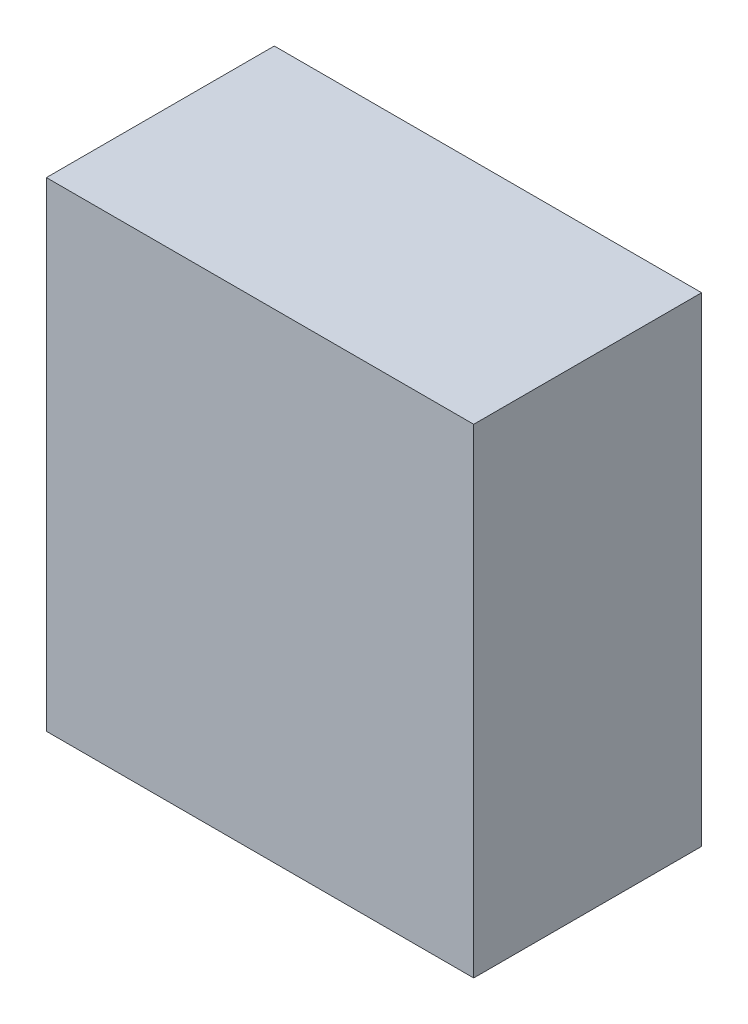
ISO-10303-21;
HEADER;
FILE_DESCRIPTION(('STEP AP214'),'2;1');
FILE_NAME('part.step','',(''),(''),'','','');
FILE_SCHEMA(('AUTOMOTIVE_DESIGN { 1 0 10303 214 1 1 1 1 }'));
ENDSEC;
DATA;
#1=APPLICATION_CONTEXT('core data for automotive mechanical design processes');
#2=APPLICATION_PROTOCOL_DEFINITION('international standard','automotive_design',2000,#1);
#3=PRODUCT_CONTEXT('',#1,'mechanical');
#4=PRODUCT('Part','Part','',(#3));
#5=PRODUCT_RELATED_PRODUCT_CATEGORY('part','',(#4));
#6=PRODUCT_DEFINITION_FORMATION('','',#4);
#7=PRODUCT_DEFINITION_CONTEXT('part definition',#1,'design');
#8=PRODUCT_DEFINITION('design','',#6,#7);
#9=PRODUCT_DEFINITION_SHAPE('','',#8);
#10=(LENGTH_UNIT() NAMED_UNIT(*) SI_UNIT(.MILLI.,.METRE.));
#11=(NAMED_UNIT(*) PLANE_ANGLE_UNIT() SI_UNIT($,.RADIAN.));
#12=(NAMED_UNIT(*) SI_UNIT($,.STERADIAN.) SOLID_ANGLE_UNIT());
#13=UNCERTAINTY_MEASURE_WITH_UNIT(LENGTH_MEASURE(1.E-05),#10,'distance_accuracy_value','');
#14=(GEOMETRIC_REPRESENTATION_CONTEXT(3) GLOBAL_UNCERTAINTY_ASSIGNED_CONTEXT((#13)) GLOBAL_UNIT_ASSIGNED_CONTEXT((#10,
#11,#12)) REPRESENTATION_CONTEXT('',''));
#15=CARTESIAN_POINT('',(0.,0.,0.));
#16=DIRECTION('',(0.,0.,1.));
#17=DIRECTION('',(1.,0.,0.));
#18=AXIS2_PLACEMENT_3D('',#15,#16,#17);
#19=CARTESIAN_POINT('',(-4.5,-5.05,4.8));
#20=DIRECTION('',(1.,0.,0.));
#21=DIRECTION('',(0.,0.,-1.));
#22=AXIS2_PLACEMENT_3D('',#19,#20,#21);
#23=PLANE('',#22);
#24=DIRECTION('',(0.,-1.,0.));
#25=VECTOR('',#24,1.);
#26=CARTESIAN_POINT('',(-4.5,-5.05,0.));
#27=LINE('',#26,#25);
#28=CARTESIAN_POINT('',(-4.5,5.05,0.));
#29=VERTEX_POINT('',#28);
#30=CARTESIAN_POINT('',(-4.5,-5.05,0.));
#31=VERTEX_POINT('',#30);
#32=EDGE_CURVE('E96',#29,#31,#27,.T.);
#33=ORIENTED_EDGE('',*,*,#32,.T.);
#34=DIRECTION('',(0.,0.,-1.));
#35=VECTOR('',#34,1.);
#36=CARTESIAN_POINT('',(-4.5,-5.05,4.8));
#37=LINE('',#36,#35);
#38=CARTESIAN_POINT('',(-4.5,-5.05,4.8));
#39=VERTEX_POINT('',#38);
#40=EDGE_CURVE('E11',#39,#31,#37,.T.);
#41=ORIENTED_EDGE('',*,*,#40,.F.);
#42=DIRECTION('',(0.,-1.,0.));
#43=VECTOR('',#42,1.);
#44=CARTESIAN_POINT('',(-4.5,-5.05,4.8));
#45=LINE('',#44,#43);
#46=CARTESIAN_POINT('',(-4.5,5.05,4.8));
#47=VERTEX_POINT('',#46);
#48=EDGE_CURVE('E84',#47,#39,#45,.T.);
#49=ORIENTED_EDGE('',*,*,#48,.F.);
#50=DIRECTION('',(0.,0.,-1.));
#51=VECTOR('',#50,1.);
#52=CARTESIAN_POINT('',(-4.5,5.05,4.8));
#53=LINE('',#52,#51);
#54=EDGE_CURVE('E92',#47,#29,#53,.T.);
#55=ORIENTED_EDGE('',*,*,#54,.T.);
#56=EDGE_LOOP('',(#33,#41,#49,#55));
#57=FACE_BOUND('',#56,.T.);
#58=ADVANCED_FACE('F33',(#57),#23,.F.);
#59=CARTESIAN_POINT('',(4.5,-5.05,4.8));
#60=DIRECTION('',(0.,1.,0.));
#61=DIRECTION('',(-1.,0.,0.));
#62=AXIS2_PLACEMENT_3D('',#59,#60,#61);
#63=PLANE('',#62);
#64=DIRECTION('',(1.,0.,0.));
#65=VECTOR('',#64,1.);
#66=CARTESIAN_POINT('',(4.5,-5.05,0.));
#67=LINE('',#66,#65);
#68=CARTESIAN_POINT('',(4.5,-5.05,0.));
#69=VERTEX_POINT('',#68);
#70=EDGE_CURVE('E88',#31,#69,#67,.T.);
#71=ORIENTED_EDGE('',*,*,#70,.T.);
#72=DIRECTION('',(0.,0.,-1.));
#73=VECTOR('',#72,1.);
#74=CARTESIAN_POINT('',(4.5,-5.05,4.8));
#75=LINE('',#74,#73);
#76=CARTESIAN_POINT('',(4.5,-5.05,4.8));
#77=VERTEX_POINT('',#76);
#78=EDGE_CURVE('E41',#77,#69,#75,.T.);
#79=ORIENTED_EDGE('',*,*,#78,.F.);
#80=DIRECTION('',(1.,0.,0.));
#81=VECTOR('',#80,1.);
#82=CARTESIAN_POINT('',(4.5,-5.05,4.8));
#83=LINE('',#82,#81);
#84=EDGE_CURVE('E79',#39,#77,#83,.T.);
#85=ORIENTED_EDGE('',*,*,#84,.F.);
#86=ORIENTED_EDGE('',*,*,#40,.T.);
#87=EDGE_LOOP('',(#71,#79,#85,#86));
#88=FACE_BOUND('',#87,.T.);
#89=ADVANCED_FACE('F87',(#88),#63,.F.);
#90=CARTESIAN_POINT('',(4.5,-5.05,4.8));
#91=DIRECTION('',(-1.,0.,0.));
#92=DIRECTION('',(0.,0.,1.));
#93=AXIS2_PLACEMENT_3D('',#90,#91,#92);
#94=PLANE('',#93);
#95=DIRECTION('',(0.,1.,0.));
#96=VECTOR('',#95,1.);
#97=CARTESIAN_POINT('',(4.5,-5.05,0.));
#98=LINE('',#97,#96);
#99=CARTESIAN_POINT('',(4.5,5.05,0.));
#100=VERTEX_POINT('',#99);
#101=EDGE_CURVE('E66',#69,#100,#98,.T.);
#102=ORIENTED_EDGE('',*,*,#101,.T.);
#103=DIRECTION('',(0.,0.,-1.));
#104=VECTOR('',#103,1.);
#105=CARTESIAN_POINT('',(4.5,5.05,4.8));
#106=LINE('',#105,#104);
#107=CARTESIAN_POINT('',(4.5,5.05,4.8));
#108=VERTEX_POINT('',#107);
#109=EDGE_CURVE('E89',#108,#100,#106,.T.);
#110=ORIENTED_EDGE('',*,*,#109,.F.);
#111=DIRECTION('',(0.,1.,0.));
#112=VECTOR('',#111,1.);
#113=CARTESIAN_POINT('',(4.5,-5.05,4.8));
#114=LINE('',#113,#112);
#115=EDGE_CURVE('E82',#77,#108,#114,.T.);
#116=ORIENTED_EDGE('',*,*,#115,.F.);
#117=ORIENTED_EDGE('',*,*,#78,.T.);
#118=EDGE_LOOP('',(#102,#110,#116,#117));
#119=FACE_BOUND('',#118,.T.);
#120=ADVANCED_FACE('F90',(#119),#94,.F.);
#121=CARTESIAN_POINT('',(4.5,5.05,4.8));
#122=DIRECTION('',(0.,-1.,0.));
#123=DIRECTION('',(1.,0.,0.));
#124=AXIS2_PLACEMENT_3D('',#121,#122,#123);
#125=PLANE('',#124);
#126=DIRECTION('',(-1.,0.,0.));
#127=VECTOR('',#126,1.);
#128=CARTESIAN_POINT('',(4.5,5.05,0.));
#129=LINE('',#128,#127);
#130=EDGE_CURVE('E72',#100,#29,#129,.T.);
#131=ORIENTED_EDGE('',*,*,#130,.T.);
#132=ORIENTED_EDGE('',*,*,#54,.F.);
#133=DIRECTION('',(-1.,0.,0.));
#134=VECTOR('',#133,1.);
#135=CARTESIAN_POINT('',(4.5,5.05,4.8));
#136=LINE('',#135,#134);
#137=EDGE_CURVE('E49',#108,#47,#136,.T.);
#138=ORIENTED_EDGE('',*,*,#137,.F.);
#139=ORIENTED_EDGE('',*,*,#109,.T.);
#140=EDGE_LOOP('',(#131,#132,#138,#139));
#141=FACE_BOUND('',#140,.T.);
#142=ADVANCED_FACE('F103',(#141),#125,.F.);
#143=CARTESIAN_POINT('',(0.,0.,4.8));
#144=DIRECTION('',(0.,0.,1.));
#145=DIRECTION('',(1.,0.,0.));
#146=AXIS2_PLACEMENT_3D('',#143,#144,#145);
#147=PLANE('',#146);
#148=ORIENTED_EDGE('',*,*,#48,.T.);
#149=ORIENTED_EDGE('',*,*,#84,.T.);
#150=ORIENTED_EDGE('',*,*,#115,.T.);
#151=ORIENTED_EDGE('',*,*,#137,.T.);
#152=EDGE_LOOP('',(#148,#149,#150,#151));
#153=FACE_BOUND('',#152,.T.);
#154=ADVANCED_FACE('F80',(#153),#147,.T.);
#155=CARTESIAN_POINT('',(0.,0.,0.));
#156=DIRECTION('',(0.,0.,1.));
#157=DIRECTION('',(1.,0.,0.));
#158=AXIS2_PLACEMENT_3D('',#155,#156,#157);
#159=PLANE('',#158);
#160=ORIENTED_EDGE('',*,*,#32,.F.);
#161=ORIENTED_EDGE('',*,*,#130,.F.);
#162=ORIENTED_EDGE('',*,*,#101,.F.);
#163=ORIENTED_EDGE('',*,*,#70,.F.);
#164=EDGE_LOOP('',(#160,#161,#162,#163));
#165=FACE_BOUND('',#164,.T.);
#166=ADVANCED_FACE('F106',(#165),#159,.F.);
#167=CLOSED_SHELL('',(#58,#89,#120,#142,#154,#166));
#168=MANIFOLD_SOLID_BREP('B2',#167);
#169=ADVANCED_BREP_SHAPE_REPRESENTATION('',(#18,#168),#14);
#170=SHAPE_DEFINITION_REPRESENTATION(#9,#169);
ENDSEC;
END-ISO-10303-21;
